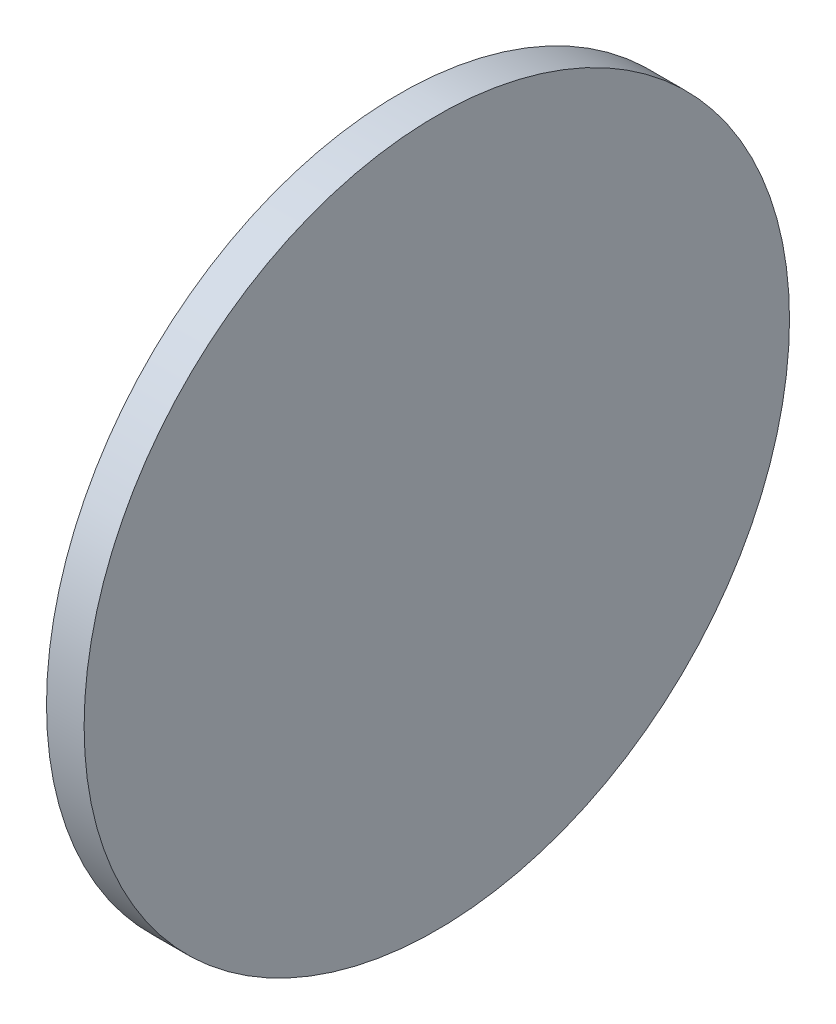
ISO-10303-21;
HEADER;
FILE_DESCRIPTION(('STEP AP214'),'2;1');
FILE_NAME('part.step','',(''),(''),'','','');
FILE_SCHEMA(('AUTOMOTIVE_DESIGN { 1 0 10303 214 1 1 1 1 }'));
ENDSEC;
DATA;
#1=APPLICATION_CONTEXT('core data for automotive mechanical design processes');
#2=APPLICATION_PROTOCOL_DEFINITION('international standard','automotive_design',2000,#1);
#3=PRODUCT_CONTEXT('',#1,'mechanical');
#4=PRODUCT('Part','Part','',(#3));
#5=PRODUCT_RELATED_PRODUCT_CATEGORY('part','',(#4));
#6=PRODUCT_DEFINITION_FORMATION('','',#4);
#7=PRODUCT_DEFINITION_CONTEXT('part definition',#1,'design');
#8=PRODUCT_DEFINITION('design','',#6,#7);
#9=PRODUCT_DEFINITION_SHAPE('','',#8);
#10=(LENGTH_UNIT() NAMED_UNIT(*) SI_UNIT(.MILLI.,.METRE.));
#11=(NAMED_UNIT(*) PLANE_ANGLE_UNIT() SI_UNIT($,.RADIAN.));
#12=(NAMED_UNIT(*) SI_UNIT($,.STERADIAN.) SOLID_ANGLE_UNIT());
#13=UNCERTAINTY_MEASURE_WITH_UNIT(LENGTH_MEASURE(1.E-05),#10,'distance_accuracy_value','');
#14=(GEOMETRIC_REPRESENTATION_CONTEXT(3) GLOBAL_UNCERTAINTY_ASSIGNED_CONTEXT((#13)) GLOBAL_UNIT_ASSIGNED_CONTEXT((#10,
#11,#12)) REPRESENTATION_CONTEXT('',''));
#15=CARTESIAN_POINT('',(0.,0.,0.));
#16=DIRECTION('',(0.,0.,1.));
#17=DIRECTION('',(1.,0.,0.));
#18=AXIS2_PLACEMENT_3D('',#15,#16,#17);
#19=CARTESIAN_POINT('',(0.,205.,-60.));
#20=DIRECTION('',(-1.,0.,0.));
#21=DIRECTION('',(0.,0.,1.));
#22=AXIS2_PLACEMENT_3D('',#19,#20,#21);
#23=PLANE('',#22);
#24=CARTESIAN_POINT('',(0.,205.,-60.));
#25=DIRECTION('',(1.,0.,0.));
#26=DIRECTION('',(0.,0.,1.));
#27=AXIS2_PLACEMENT_3D('',#24,#25,#26);
#28=CIRCLE('',#27,75.);
#29=CARTESIAN_POINT('',(0.,205.,15.));
#30=VERTEX_POINT('',#29);
#31=EDGE_CURVE('E10',#30,#30,#28,.T.);
#32=ORIENTED_EDGE('',*,*,#31,.F.);
#33=EDGE_LOOP('',(#32));
#34=FACE_BOUND('',#33,.T.);
#35=CARTESIAN_POINT('',(0.,140.,-25.9999999999999));
#36=DIRECTION('',(-1.,0.,0.));
#37=DIRECTION('',(0.,0.,1.));
#38=AXIS2_PLACEMENT_3D('',#35,#36,#37);
#39=CIRCLE('',#38,1.5);
#40=CARTESIAN_POINT('',(0.,140.,-24.4999999999999));
#41=VERTEX_POINT('',#40);
#42=EDGE_CURVE('E105',#41,#41,#39,.T.);
#43=ORIENTED_EDGE('',*,*,#42,.F.);
#44=EDGE_LOOP('',(#43));
#45=FACE_BOUND('',#44,.T.);
#46=CARTESIAN_POINT('',(0.,140.,-93.9999999999999));
#47=DIRECTION('',(-1.,0.,0.));
#48=DIRECTION('',(0.,0.,1.));
#49=AXIS2_PLACEMENT_3D('',#46,#47,#48);
#50=CIRCLE('',#49,1.5);
#51=CARTESIAN_POINT('',(0.,140.,-92.4999999999999));
#52=VERTEX_POINT('',#51);
#53=EDGE_CURVE('E99',#52,#52,#50,.T.);
#54=ORIENTED_EDGE('',*,*,#53,.F.);
#55=EDGE_LOOP('',(#54));
#56=FACE_BOUND('',#55,.T.);
#57=CARTESIAN_POINT('',(0.,254.497474683058,-10.5025253169412));
#58=DIRECTION('',(1.,0.,0.));
#59=DIRECTION('',(0.,0.,-1.));
#60=AXIS2_PLACEMENT_3D('',#57,#58,#59);
#61=CIRCLE('',#60,1.75);
#62=CARTESIAN_POINT('',(0.,254.497474683058,-12.2525253169412));
#63=VERTEX_POINT('',#62);
#64=EDGE_CURVE('E90',#63,#63,#61,.T.);
#65=ORIENTED_EDGE('',*,*,#64,.T.);
#66=EDGE_LOOP('',(#65));
#67=FACE_BOUND('',#66,.T.);
#68=CARTESIAN_POINT('',(0.,205.,10.));
#69=DIRECTION('',(1.,0.,0.));
#70=DIRECTION('',(0.,0.,-1.));
#71=AXIS2_PLACEMENT_3D('',#68,#69,#70);
#72=CIRCLE('',#71,1.75);
#73=CARTESIAN_POINT('',(0.,205.,8.25000000000002));
#74=VERTEX_POINT('',#73);
#75=EDGE_CURVE('E84',#74,#74,#72,.T.);
#76=ORIENTED_EDGE('',*,*,#75,.T.);
#77=EDGE_LOOP('',(#76));
#78=FACE_BOUND('',#77,.T.);
#79=CARTESIAN_POINT('',(0.,140.,-81.));
#80=DIRECTION('',(1.,0.,0.));
#81=DIRECTION('',(0.,0.,-1.));
#82=AXIS2_PLACEMENT_3D('',#79,#80,#81);
#83=CIRCLE('',#82,1.75);
#84=CARTESIAN_POINT('',(0.,140.,-82.75));
#85=VERTEX_POINT('',#84);
#86=EDGE_CURVE('E78',#85,#85,#83,.T.);
#87=ORIENTED_EDGE('',*,*,#86,.T.);
#88=EDGE_LOOP('',(#87));
#89=FACE_BOUND('',#88,.T.);
#90=CARTESIAN_POINT('',(0.,170.,-88.));
#91=DIRECTION('',(1.,0.,0.));
#92=DIRECTION('',(0.,0.,-1.));
#93=AXIS2_PLACEMENT_3D('',#90,#91,#92);
#94=CIRCLE('',#93,1.75);
#95=CARTESIAN_POINT('',(0.,170.,-89.75));
#96=VERTEX_POINT('',#95);
#97=EDGE_CURVE('E72',#96,#96,#94,.T.);
#98=ORIENTED_EDGE('',*,*,#97,.T.);
#99=EDGE_LOOP('',(#98));
#100=FACE_BOUND('',#99,.T.);
#101=CARTESIAN_POINT('',(0.,170.,-102.));
#102=DIRECTION('',(1.,0.,0.));
#103=DIRECTION('',(0.,0.,-1.));
#104=AXIS2_PLACEMENT_3D('',#101,#102,#103);
#105=CIRCLE('',#104,1.75);
#106=CARTESIAN_POINT('',(0.,170.,-103.75));
#107=VERTEX_POINT('',#106);
#108=EDGE_CURVE('E66',#107,#107,#105,.T.);
#109=ORIENTED_EDGE('',*,*,#108,.T.);
#110=EDGE_LOOP('',(#109));
#111=FACE_BOUND('',#110,.T.);
#112=CARTESIAN_POINT('',(0.,170.,-18.));
#113=DIRECTION('',(1.,0.,0.));
#114=DIRECTION('',(0.,0.,-1.));
#115=AXIS2_PLACEMENT_3D('',#112,#113,#114);
#116=CIRCLE('',#115,1.75);
#117=CARTESIAN_POINT('',(0.,170.,-19.75));
#118=VERTEX_POINT('',#117);
#119=EDGE_CURVE('E60',#118,#118,#116,.T.);
#120=ORIENTED_EDGE('',*,*,#119,.T.);
#121=EDGE_LOOP('',(#120));
#122=FACE_BOUND('',#121,.T.);
#123=CARTESIAN_POINT('',(0.,170.,-32.));
#124=DIRECTION('',(1.,0.,0.));
#125=DIRECTION('',(0.,0.,-1.));
#126=AXIS2_PLACEMENT_3D('',#123,#124,#125);
#127=CIRCLE('',#126,1.75);
#128=CARTESIAN_POINT('',(0.,170.,-33.75));
#129=VERTEX_POINT('',#128);
#130=EDGE_CURVE('E52',#129,#129,#127,.T.);
#131=ORIENTED_EDGE('',*,*,#130,.T.);
#132=EDGE_LOOP('',(#131));
#133=FACE_BOUND('',#132,.T.);
#134=CARTESIAN_POINT('',(0.,205.,-60.));
#135=DIRECTION('',(1.,0.,0.));
#136=DIRECTION('',(0.,0.,-1.));
#137=AXIS2_PLACEMENT_3D('',#134,#135,#136);
#138=CIRCLE('',#137,12.5);
#139=CARTESIAN_POINT('',(0.,205.,-72.5));
#140=VERTEX_POINT('',#139);
#141=EDGE_CURVE('E44',#140,#140,#138,.T.);
#142=ORIENTED_EDGE('',*,*,#141,.T.);
#143=EDGE_LOOP('',(#142));
#144=FACE_BOUND('',#143,.T.);
#145=CARTESIAN_POINT('',(0.,177.,-25.));
#146=DIRECTION('',(1.,0.,0.));
#147=DIRECTION('',(0.,0.,-1.));
#148=AXIS2_PLACEMENT_3D('',#145,#146,#147);
#149=CIRCLE('',#148,1.75);
#150=CARTESIAN_POINT('',(0.,177.,-26.75));
#151=VERTEX_POINT('',#150);
#152=EDGE_CURVE('E48',#151,#151,#149,.T.);
#153=ORIENTED_EDGE('',*,*,#152,.T.);
#154=EDGE_LOOP('',(#153));
#155=FACE_BOUND('',#154,.T.);
#156=CARTESIAN_POINT('',(0.,163.,-25.));
#157=DIRECTION('',(1.,0.,0.));
#158=DIRECTION('',(0.,0.,-1.));
#159=AXIS2_PLACEMENT_3D('',#156,#157,#158);
#160=CIRCLE('',#159,1.75);
#161=CARTESIAN_POINT('',(0.,163.,-26.75));
#162=VERTEX_POINT('',#161);
#163=EDGE_CURVE('E57',#162,#162,#160,.T.);
#164=ORIENTED_EDGE('',*,*,#163,.T.);
#165=EDGE_LOOP('',(#164));
#166=FACE_BOUND('',#165,.T.);
#167=CARTESIAN_POINT('',(0.,177.,-95.));
#168=DIRECTION('',(1.,0.,0.));
#169=DIRECTION('',(0.,0.,-1.));
#170=AXIS2_PLACEMENT_3D('',#167,#168,#169);
#171=CIRCLE('',#170,1.75);
#172=CARTESIAN_POINT('',(0.,177.,-96.75));
#173=VERTEX_POINT('',#172);
#174=EDGE_CURVE('E63',#173,#173,#171,.T.);
#175=ORIENTED_EDGE('',*,*,#174,.T.);
#176=EDGE_LOOP('',(#175));
#177=FACE_BOUND('',#176,.T.);
#178=CARTESIAN_POINT('',(0.,163.,-95.));
#179=DIRECTION('',(1.,0.,0.));
#180=DIRECTION('',(0.,0.,-1.));
#181=AXIS2_PLACEMENT_3D('',#178,#179,#180);
#182=CIRCLE('',#181,1.75);
#183=CARTESIAN_POINT('',(0.,163.,-96.75));
#184=VERTEX_POINT('',#183);
#185=EDGE_CURVE('E69',#184,#184,#182,.T.);
#186=ORIENTED_EDGE('',*,*,#185,.T.);
#187=EDGE_LOOP('',(#186));
#188=FACE_BOUND('',#187,.T.);
#189=CARTESIAN_POINT('',(0.,140.,-39.));
#190=DIRECTION('',(1.,0.,0.));
#191=DIRECTION('',(0.,0.,-1.));
#192=AXIS2_PLACEMENT_3D('',#189,#190,#191);
#193=CIRCLE('',#192,1.75);
#194=CARTESIAN_POINT('',(0.,140.,-40.75));
#195=VERTEX_POINT('',#194);
#196=EDGE_CURVE('E75',#195,#195,#193,.T.);
#197=ORIENTED_EDGE('',*,*,#196,.T.);
#198=EDGE_LOOP('',(#197));
#199=FACE_BOUND('',#198,.T.);
#200=CARTESIAN_POINT('',(0.,275.,-60.));
#201=DIRECTION('',(1.,0.,0.));
#202=DIRECTION('',(0.,0.,-1.));
#203=AXIS2_PLACEMENT_3D('',#200,#201,#202);
#204=CIRCLE('',#203,1.75);
#205=CARTESIAN_POINT('',(0.,275.,-61.75));
#206=VERTEX_POINT('',#205);
#207=EDGE_CURVE('E81',#206,#206,#204,.T.);
#208=ORIENTED_EDGE('',*,*,#207,.T.);
#209=EDGE_LOOP('',(#208));
#210=FACE_BOUND('',#209,.T.);
#211=CARTESIAN_POINT('',(0.,205.,-130.));
#212=DIRECTION('',(1.,0.,0.));
#213=DIRECTION('',(0.,0.,-1.));
#214=AXIS2_PLACEMENT_3D('',#211,#212,#213);
#215=CIRCLE('',#214,1.75000000000001);
#216=CARTESIAN_POINT('',(0.,205.,-131.75));
#217=VERTEX_POINT('',#216);
#218=EDGE_CURVE('E87',#217,#217,#215,.T.);
#219=ORIENTED_EDGE('',*,*,#218,.T.);
#220=EDGE_LOOP('',(#219));
#221=FACE_BOUND('',#220,.T.);
#222=CARTESIAN_POINT('',(0.,254.497474683059,-109.497474683058));
#223=DIRECTION('',(1.,0.,0.));
#224=DIRECTION('',(0.,0.,-1.));
#225=AXIS2_PLACEMENT_3D('',#222,#223,#224);
#226=CIRCLE('',#225,1.75);
#227=CARTESIAN_POINT('',(0.,254.497474683059,-111.247474683058));
#228=VERTEX_POINT('',#227);
#229=EDGE_CURVE('E93',#228,#228,#226,.T.);
#230=ORIENTED_EDGE('',*,*,#229,.T.);
#231=EDGE_LOOP('',(#230));
#232=FACE_BOUND('',#231,.T.);
#233=ADVANCED_FACE('F37',(#34,#45,#56,#67,#78,#89,#100,#111,#122,#133,#144,#155,#166,#177,#188,
#199,#210,#221,#232),#23,.T.);
#234=CARTESIAN_POINT('',(5.,205.,-60.));
#235=DIRECTION('',(-1.,0.,0.));
#236=DIRECTION('',(0.,0.,1.));
#237=AXIS2_PLACEMENT_3D('',#234,#235,#236);
#238=CYLINDRICAL_SURFACE('',#237,75.);
#239=ORIENTED_EDGE('',*,*,#31,.T.);
#240=EDGE_LOOP('',(#239));
#241=FACE_BOUND('',#240,.T.);
#242=CARTESIAN_POINT('',(8.,205.,-60.));
#243=DIRECTION('',(1.,0.,0.));
#244=DIRECTION('',(0.,0.,-1.));
#245=AXIS2_PLACEMENT_3D('',#242,#243,#244);
#246=CIRCLE('',#245,75.);
#247=CARTESIAN_POINT('',(8.,205.,-135.));
#248=VERTEX_POINT('',#247);
#249=EDGE_CURVE('E156',#248,#248,#246,.T.);
#250=ORIENTED_EDGE('',*,*,#249,.F.);
#251=EDGE_LOOP('',(#250));
#252=FACE_BOUND('',#251,.T.);
#253=ADVANCED_FACE('F39',(#241,#252),#238,.T.);
#254=CARTESIAN_POINT('',(5.,205.,-60.));
#255=DIRECTION('',(-1.,0.,0.));
#256=DIRECTION('',(0.,0.,1.));
#257=AXIS2_PLACEMENT_3D('',#254,#255,#256);
#258=CYLINDRICAL_SURFACE('',#257,12.5);
#259=CARTESIAN_POINT('',(5.,205.,-60.));
#260=DIRECTION('',(1.,0.,0.));
#261=DIRECTION('',(0.,0.,-1.));
#262=AXIS2_PLACEMENT_3D('',#259,#260,#261);
#263=CIRCLE('',#262,12.5);
#264=CARTESIAN_POINT('',(5.,205.,-72.5));
#265=VERTEX_POINT('',#264);
#266=EDGE_CURVE('E108',#265,#265,#263,.T.);
#267=ORIENTED_EDGE('',*,*,#266,.T.);
#268=EDGE_LOOP('',(#267));
#269=FACE_BOUND('',#268,.T.);
#270=ORIENTED_EDGE('',*,*,#141,.F.);
#271=EDGE_LOOP('',(#270));
#272=FACE_BOUND('',#271,.T.);
#273=ADVANCED_FACE('F163',(#269,#272),#258,.F.);
#274=CARTESIAN_POINT('',(5.,177.,-25.));
#275=DIRECTION('',(-1.,0.,0.));
#276=DIRECTION('',(0.,0.,1.));
#277=AXIS2_PLACEMENT_3D('',#274,#275,#276);
#278=CYLINDRICAL_SURFACE('',#277,1.75);
#279=CARTESIAN_POINT('',(5.,177.,-25.));
#280=DIRECTION('',(1.,0.,0.));
#281=DIRECTION('',(0.,0.,-1.));
#282=AXIS2_PLACEMENT_3D('',#279,#280,#281);
#283=CIRCLE('',#282,1.75);
#284=CARTESIAN_POINT('',(5.,177.,-26.75));
#285=VERTEX_POINT('',#284);
#286=EDGE_CURVE('E111',#285,#285,#283,.T.);
#287=ORIENTED_EDGE('',*,*,#286,.T.);
#288=EDGE_LOOP('',(#287));
#289=FACE_BOUND('',#288,.T.);
#290=ORIENTED_EDGE('',*,*,#152,.F.);
#291=EDGE_LOOP('',(#290));
#292=FACE_BOUND('',#291,.T.);
#293=ADVANCED_FACE('F169',(#289,#292),#278,.F.);
#294=CARTESIAN_POINT('',(5.,170.,-32.));
#295=DIRECTION('',(-1.,0.,0.));
#296=DIRECTION('',(0.,0.,1.));
#297=AXIS2_PLACEMENT_3D('',#294,#295,#296);
#298=CYLINDRICAL_SURFACE('',#297,1.75);
#299=CARTESIAN_POINT('',(5.,170.,-32.));
#300=DIRECTION('',(1.,0.,0.));
#301=DIRECTION('',(0.,0.,-1.));
#302=AXIS2_PLACEMENT_3D('',#299,#300,#301);
#303=CIRCLE('',#302,1.75);
#304=CARTESIAN_POINT('',(5.,170.,-33.75));
#305=VERTEX_POINT('',#304);
#306=EDGE_CURVE('E114',#305,#305,#303,.T.);
#307=ORIENTED_EDGE('',*,*,#306,.T.);
#308=EDGE_LOOP('',(#307));
#309=FACE_BOUND('',#308,.T.);
#310=ORIENTED_EDGE('',*,*,#130,.F.);
#311=EDGE_LOOP('',(#310));
#312=FACE_BOUND('',#311,.T.);
#313=ADVANCED_FACE('F181',(#309,#312),#298,.F.);
#314=CARTESIAN_POINT('',(5.,163.,-25.));
#315=DIRECTION('',(-1.,0.,0.));
#316=DIRECTION('',(0.,0.,1.));
#317=AXIS2_PLACEMENT_3D('',#314,#315,#316);
#318=CYLINDRICAL_SURFACE('',#317,1.75);
#319=CARTESIAN_POINT('',(5.,163.,-25.));
#320=DIRECTION('',(1.,0.,0.));
#321=DIRECTION('',(0.,0.,-1.));
#322=AXIS2_PLACEMENT_3D('',#319,#320,#321);
#323=CIRCLE('',#322,1.75);
#324=CARTESIAN_POINT('',(5.,163.,-26.75));
#325=VERTEX_POINT('',#324);
#326=EDGE_CURVE('E117',#325,#325,#323,.T.);
#327=ORIENTED_EDGE('',*,*,#326,.T.);
#328=EDGE_LOOP('',(#327));
#329=FACE_BOUND('',#328,.T.);
#330=ORIENTED_EDGE('',*,*,#163,.F.);
#331=EDGE_LOOP('',(#330));
#332=FACE_BOUND('',#331,.T.);
#333=ADVANCED_FACE('F185',(#329,#332),#318,.F.);
#334=CARTESIAN_POINT('',(5.,170.,-18.));
#335=DIRECTION('',(-1.,0.,0.));
#336=DIRECTION('',(0.,0.,1.));
#337=AXIS2_PLACEMENT_3D('',#334,#335,#336);
#338=CYLINDRICAL_SURFACE('',#337,1.75);
#339=CARTESIAN_POINT('',(5.,170.,-18.));
#340=DIRECTION('',(1.,0.,0.));
#341=DIRECTION('',(0.,0.,-1.));
#342=AXIS2_PLACEMENT_3D('',#339,#340,#341);
#343=CIRCLE('',#342,1.75);
#344=CARTESIAN_POINT('',(5.,170.,-19.75));
#345=VERTEX_POINT('',#344);
#346=EDGE_CURVE('E120',#345,#345,#343,.T.);
#347=ORIENTED_EDGE('',*,*,#346,.T.);
#348=EDGE_LOOP('',(#347));
#349=FACE_BOUND('',#348,.T.);
#350=ORIENTED_EDGE('',*,*,#119,.F.);
#351=EDGE_LOOP('',(#350));
#352=FACE_BOUND('',#351,.T.);
#353=ADVANCED_FACE('F189',(#349,#352),#338,.F.);
#354=CARTESIAN_POINT('',(5.,177.,-95.));
#355=DIRECTION('',(-1.,0.,0.));
#356=DIRECTION('',(0.,0.,1.));
#357=AXIS2_PLACEMENT_3D('',#354,#355,#356);
#358=CYLINDRICAL_SURFACE('',#357,1.75);
#359=CARTESIAN_POINT('',(5.,177.,-95.));
#360=DIRECTION('',(1.,0.,0.));
#361=DIRECTION('',(0.,0.,-1.));
#362=AXIS2_PLACEMENT_3D('',#359,#360,#361);
#363=CIRCLE('',#362,1.75);
#364=CARTESIAN_POINT('',(5.,177.,-96.75));
#365=VERTEX_POINT('',#364);
#366=EDGE_CURVE('E123',#365,#365,#363,.T.);
#367=ORIENTED_EDGE('',*,*,#366,.T.);
#368=EDGE_LOOP('',(#367));
#369=FACE_BOUND('',#368,.T.);
#370=ORIENTED_EDGE('',*,*,#174,.F.);
#371=EDGE_LOOP('',(#370));
#372=FACE_BOUND('',#371,.T.);
#373=ADVANCED_FACE('F193',(#369,#372),#358,.F.);
#374=CARTESIAN_POINT('',(5.,170.,-102.));
#375=DIRECTION('',(-1.,0.,0.));
#376=DIRECTION('',(0.,0.,1.));
#377=AXIS2_PLACEMENT_3D('',#374,#375,#376);
#378=CYLINDRICAL_SURFACE('',#377,1.75);
#379=CARTESIAN_POINT('',(5.,170.,-102.));
#380=DIRECTION('',(1.,0.,0.));
#381=DIRECTION('',(0.,0.,-1.));
#382=AXIS2_PLACEMENT_3D('',#379,#380,#381);
#383=CIRCLE('',#382,1.75);
#384=CARTESIAN_POINT('',(5.,170.,-103.75));
#385=VERTEX_POINT('',#384);
#386=EDGE_CURVE('E126',#385,#385,#383,.T.);
#387=ORIENTED_EDGE('',*,*,#386,.T.);
#388=EDGE_LOOP('',(#387));
#389=FACE_BOUND('',#388,.T.);
#390=ORIENTED_EDGE('',*,*,#108,.F.);
#391=EDGE_LOOP('',(#390));
#392=FACE_BOUND('',#391,.T.);
#393=ADVANCED_FACE('F197',(#389,#392),#378,.F.);
#394=CARTESIAN_POINT('',(5.,163.,-95.));
#395=DIRECTION('',(-1.,0.,0.));
#396=DIRECTION('',(0.,0.,1.));
#397=AXIS2_PLACEMENT_3D('',#394,#395,#396);
#398=CYLINDRICAL_SURFACE('',#397,1.75);
#399=CARTESIAN_POINT('',(5.,163.,-95.));
#400=DIRECTION('',(1.,0.,0.));
#401=DIRECTION('',(0.,0.,-1.));
#402=AXIS2_PLACEMENT_3D('',#399,#400,#401);
#403=CIRCLE('',#402,1.75);
#404=CARTESIAN_POINT('',(5.,163.,-96.75));
#405=VERTEX_POINT('',#404);
#406=EDGE_CURVE('E129',#405,#405,#403,.T.);
#407=ORIENTED_EDGE('',*,*,#406,.T.);
#408=EDGE_LOOP('',(#407));
#409=FACE_BOUND('',#408,.T.);
#410=ORIENTED_EDGE('',*,*,#185,.F.);
#411=EDGE_LOOP('',(#410));
#412=FACE_BOUND('',#411,.T.);
#413=ADVANCED_FACE('F201',(#409,#412),#398,.F.);
#414=CARTESIAN_POINT('',(5.,170.,-88.));
#415=DIRECTION('',(-1.,0.,0.));
#416=DIRECTION('',(0.,0.,1.));
#417=AXIS2_PLACEMENT_3D('',#414,#415,#416);
#418=CYLINDRICAL_SURFACE('',#417,1.75);
#419=CARTESIAN_POINT('',(5.,170.,-88.));
#420=DIRECTION('',(1.,0.,0.));
#421=DIRECTION('',(0.,0.,-1.));
#422=AXIS2_PLACEMENT_3D('',#419,#420,#421);
#423=CIRCLE('',#422,1.75);
#424=CARTESIAN_POINT('',(5.,170.,-89.75));
#425=VERTEX_POINT('',#424);
#426=EDGE_CURVE('E132',#425,#425,#423,.T.);
#427=ORIENTED_EDGE('',*,*,#426,.T.);
#428=EDGE_LOOP('',(#427));
#429=FACE_BOUND('',#428,.T.);
#430=ORIENTED_EDGE('',*,*,#97,.F.);
#431=EDGE_LOOP('',(#430));
#432=FACE_BOUND('',#431,.T.);
#433=ADVANCED_FACE('F205',(#429,#432),#418,.F.);
#434=CARTESIAN_POINT('',(5.,140.,-39.));
#435=DIRECTION('',(-1.,0.,0.));
#436=DIRECTION('',(0.,0.,1.));
#437=AXIS2_PLACEMENT_3D('',#434,#435,#436);
#438=CYLINDRICAL_SURFACE('',#437,1.75);
#439=CARTESIAN_POINT('',(5.,140.,-39.));
#440=DIRECTION('',(1.,0.,0.));
#441=DIRECTION('',(0.,0.,-1.));
#442=AXIS2_PLACEMENT_3D('',#439,#440,#441);
#443=CIRCLE('',#442,1.75);
#444=CARTESIAN_POINT('',(5.,140.,-40.75));
#445=VERTEX_POINT('',#444);
#446=EDGE_CURVE('E135',#445,#445,#443,.T.);
#447=ORIENTED_EDGE('',*,*,#446,.T.);
#448=EDGE_LOOP('',(#447));
#449=FACE_BOUND('',#448,.T.);
#450=ORIENTED_EDGE('',*,*,#196,.F.);
#451=EDGE_LOOP('',(#450));
#452=FACE_BOUND('',#451,.T.);
#453=ADVANCED_FACE('F209',(#449,#452),#438,.F.);
#454=CARTESIAN_POINT('',(5.,140.,-81.));
#455=DIRECTION('',(-1.,0.,0.));
#456=DIRECTION('',(0.,0.,1.));
#457=AXIS2_PLACEMENT_3D('',#454,#455,#456);
#458=CYLINDRICAL_SURFACE('',#457,1.75);
#459=CARTESIAN_POINT('',(5.,140.,-81.));
#460=DIRECTION('',(1.,0.,0.));
#461=DIRECTION('',(0.,0.,-1.));
#462=AXIS2_PLACEMENT_3D('',#459,#460,#461);
#463=CIRCLE('',#462,1.75);
#464=CARTESIAN_POINT('',(5.,140.,-82.75));
#465=VERTEX_POINT('',#464);
#466=EDGE_CURVE('E138',#465,#465,#463,.T.);
#467=ORIENTED_EDGE('',*,*,#466,.T.);
#468=EDGE_LOOP('',(#467));
#469=FACE_BOUND('',#468,.T.);
#470=ORIENTED_EDGE('',*,*,#86,.F.);
#471=EDGE_LOOP('',(#470));
#472=FACE_BOUND('',#471,.T.);
#473=ADVANCED_FACE('F213',(#469,#472),#458,.F.);
#474=CARTESIAN_POINT('',(5.,275.,-60.));
#475=DIRECTION('',(-1.,0.,0.));
#476=DIRECTION('',(0.,0.,1.));
#477=AXIS2_PLACEMENT_3D('',#474,#475,#476);
#478=CYLINDRICAL_SURFACE('',#477,1.75);
#479=CARTESIAN_POINT('',(5.,275.,-60.));
#480=DIRECTION('',(1.,0.,0.));
#481=DIRECTION('',(0.,0.,-1.));
#482=AXIS2_PLACEMENT_3D('',#479,#480,#481);
#483=CIRCLE('',#482,1.75);
#484=CARTESIAN_POINT('',(5.,275.,-61.75));
#485=VERTEX_POINT('',#484);
#486=EDGE_CURVE('E141',#485,#485,#483,.T.);
#487=ORIENTED_EDGE('',*,*,#486,.T.);
#488=EDGE_LOOP('',(#487));
#489=FACE_BOUND('',#488,.T.);
#490=ORIENTED_EDGE('',*,*,#207,.F.);
#491=EDGE_LOOP('',(#490));
#492=FACE_BOUND('',#491,.T.);
#493=ADVANCED_FACE('F217',(#489,#492),#478,.F.);
#494=CARTESIAN_POINT('',(5.,205.,10.));
#495=DIRECTION('',(-1.,0.,0.));
#496=DIRECTION('',(0.,0.,1.));
#497=AXIS2_PLACEMENT_3D('',#494,#495,#496);
#498=CYLINDRICAL_SURFACE('',#497,1.75);
#499=CARTESIAN_POINT('',(5.,205.,10.));
#500=DIRECTION('',(1.,0.,0.));
#501=DIRECTION('',(0.,0.,-1.));
#502=AXIS2_PLACEMENT_3D('',#499,#500,#501);
#503=CIRCLE('',#502,1.75);
#504=CARTESIAN_POINT('',(5.,205.,8.25000000000002));
#505=VERTEX_POINT('',#504);
#506=EDGE_CURVE('E144',#505,#505,#503,.T.);
#507=ORIENTED_EDGE('',*,*,#506,.T.);
#508=EDGE_LOOP('',(#507));
#509=FACE_BOUND('',#508,.T.);
#510=ORIENTED_EDGE('',*,*,#75,.F.);
#511=EDGE_LOOP('',(#510));
#512=FACE_BOUND('',#511,.T.);
#513=ADVANCED_FACE('F221',(#509,#512),#498,.F.);
#514=CARTESIAN_POINT('',(5.,205.,-130.));
#515=DIRECTION('',(-1.,0.,0.));
#516=DIRECTION('',(0.,0.,1.));
#517=AXIS2_PLACEMENT_3D('',#514,#515,#516);
#518=CYLINDRICAL_SURFACE('',#517,1.75000000000001);
#519=CARTESIAN_POINT('',(5.,205.,-130.));
#520=DIRECTION('',(1.,0.,0.));
#521=DIRECTION('',(0.,0.,-1.));
#522=AXIS2_PLACEMENT_3D('',#519,#520,#521);
#523=CIRCLE('',#522,1.75000000000001);
#524=CARTESIAN_POINT('',(5.,205.,-131.75));
#525=VERTEX_POINT('',#524);
#526=EDGE_CURVE('E147',#525,#525,#523,.T.);
#527=ORIENTED_EDGE('',*,*,#526,.T.);
#528=EDGE_LOOP('',(#527));
#529=FACE_BOUND('',#528,.T.);
#530=ORIENTED_EDGE('',*,*,#218,.F.);
#531=EDGE_LOOP('',(#530));
#532=FACE_BOUND('',#531,.T.);
#533=ADVANCED_FACE('F225',(#529,#532),#518,.F.);
#534=CARTESIAN_POINT('',(5.,254.497474683058,-10.5025253169412));
#535=DIRECTION('',(-1.,0.,0.));
#536=DIRECTION('',(0.,0.,1.));
#537=AXIS2_PLACEMENT_3D('',#534,#535,#536);
#538=CYLINDRICAL_SURFACE('',#537,1.75);
#539=CARTESIAN_POINT('',(5.,254.497474683058,-10.5025253169412));
#540=DIRECTION('',(1.,0.,0.));
#541=DIRECTION('',(0.,0.,-1.));
#542=AXIS2_PLACEMENT_3D('',#539,#540,#541);
#543=CIRCLE('',#542,1.75);
#544=CARTESIAN_POINT('',(5.,254.497474683058,-12.2525253169412));
#545=VERTEX_POINT('',#544);
#546=EDGE_CURVE('E150',#545,#545,#543,.T.);
#547=ORIENTED_EDGE('',*,*,#546,.T.);
#548=EDGE_LOOP('',(#547));
#549=FACE_BOUND('',#548,.T.);
#550=ORIENTED_EDGE('',*,*,#64,.F.);
#551=EDGE_LOOP('',(#550));
#552=FACE_BOUND('',#551,.T.);
#553=ADVANCED_FACE('F229',(#549,#552),#538,.F.);
#554=CARTESIAN_POINT('',(5.,254.497474683059,-109.497474683058));
#555=DIRECTION('',(-1.,0.,0.));
#556=DIRECTION('',(0.,0.,1.));
#557=AXIS2_PLACEMENT_3D('',#554,#555,#556);
#558=CYLINDRICAL_SURFACE('',#557,1.75);
#559=CARTESIAN_POINT('',(5.,254.497474683059,-109.497474683058));
#560=DIRECTION('',(1.,0.,0.));
#561=DIRECTION('',(0.,0.,-1.));
#562=AXIS2_PLACEMENT_3D('',#559,#560,#561);
#563=CIRCLE('',#562,1.75);
#564=CARTESIAN_POINT('',(5.,254.497474683059,-111.247474683058));
#565=VERTEX_POINT('',#564);
#566=EDGE_CURVE('E153',#565,#565,#563,.T.);
#567=ORIENTED_EDGE('',*,*,#566,.T.);
#568=EDGE_LOOP('',(#567));
#569=FACE_BOUND('',#568,.T.);
#570=ORIENTED_EDGE('',*,*,#229,.F.);
#571=EDGE_LOOP('',(#570));
#572=FACE_BOUND('',#571,.T.);
#573=ADVANCED_FACE('F233',(#569,#572),#558,.F.);
#574=CARTESIAN_POINT('',(10.,140.,-93.9999999999999));
#575=DIRECTION('',(-1.,0.,0.));
#576=DIRECTION('',(0.,0.,1.));
#577=AXIS2_PLACEMENT_3D('',#574,#575,#576);
#578=CYLINDRICAL_SURFACE('',#577,1.5);
#579=ORIENTED_EDGE('',*,*,#53,.T.);
#580=EDGE_LOOP('',(#579));
#581=FACE_BOUND('',#580,.T.);
#582=CARTESIAN_POINT('',(5.,140.,-93.9999999999999));
#583=DIRECTION('',(-1.,0.,0.));
#584=DIRECTION('',(0.,0.,1.));
#585=AXIS2_PLACEMENT_3D('',#582,#583,#584);
#586=CIRCLE('',#585,1.5);
#587=CARTESIAN_POINT('',(5.,140.,-92.4999999999999));
#588=VERTEX_POINT('',#587);
#589=EDGE_CURVE('E96',#588,#588,#586,.T.);
#590=ORIENTED_EDGE('',*,*,#589,.F.);
#591=EDGE_LOOP('',(#590));
#592=FACE_BOUND('',#591,.T.);
#593=ADVANCED_FACE('F237',(#581,#592),#578,.F.);
#594=CARTESIAN_POINT('',(10.,140.,-25.9999999999999));
#595=DIRECTION('',(-1.,0.,0.));
#596=DIRECTION('',(0.,0.,1.));
#597=AXIS2_PLACEMENT_3D('',#594,#595,#596);
#598=CYLINDRICAL_SURFACE('',#597,1.5);
#599=ORIENTED_EDGE('',*,*,#42,.T.);
#600=EDGE_LOOP('',(#599));
#601=FACE_BOUND('',#600,.T.);
#602=CARTESIAN_POINT('',(5.,140.,-25.9999999999999));
#603=DIRECTION('',(-1.,0.,0.));
#604=DIRECTION('',(0.,0.,1.));
#605=AXIS2_PLACEMENT_3D('',#602,#603,#604);
#606=CIRCLE('',#605,1.5);
#607=CARTESIAN_POINT('',(5.,140.,-24.4999999999999));
#608=VERTEX_POINT('',#607);
#609=EDGE_CURVE('E102',#608,#608,#606,.T.);
#610=ORIENTED_EDGE('',*,*,#609,.F.);
#611=EDGE_LOOP('',(#610));
#612=FACE_BOUND('',#611,.T.);
#613=ADVANCED_FACE('F241',(#601,#612),#598,.F.);
#614=CARTESIAN_POINT('',(5.,205.,-60.));
#615=DIRECTION('',(1.,0.,0.));
#616=DIRECTION('',(0.,0.,-1.));
#617=AXIS2_PLACEMENT_3D('',#614,#615,#616);
#618=PLANE('',#617);
#619=ORIENTED_EDGE('',*,*,#609,.T.);
#620=EDGE_LOOP('',(#619));
#621=FACE_BOUND('',#620,.T.);
#622=ADVANCED_FACE('F244',(#621),#618,.F.);
#623=ORIENTED_EDGE('',*,*,#589,.T.);
#624=EDGE_LOOP('',(#623));
#625=FACE_BOUND('',#624,.T.);
#626=ADVANCED_FACE('F250',(#625),#618,.F.);
#627=ORIENTED_EDGE('',*,*,#566,.F.);
#628=EDGE_LOOP('',(#627));
#629=FACE_BOUND('',#628,.T.);
#630=ADVANCED_FACE('F246',(#629),#618,.F.);
#631=ORIENTED_EDGE('',*,*,#546,.F.);
#632=EDGE_LOOP('',(#631));
#633=FACE_BOUND('',#632,.T.);
#634=ADVANCED_FACE('F249',(#633),#618,.F.);
#635=ORIENTED_EDGE('',*,*,#526,.F.);
#636=EDGE_LOOP('',(#635));
#637=FACE_BOUND('',#636,.T.);
#638=ADVANCED_FACE('F368',(#637),#618,.F.);
#639=ORIENTED_EDGE('',*,*,#506,.F.);
#640=EDGE_LOOP('',(#639));
#641=FACE_BOUND('',#640,.T.);
#642=ADVANCED_FACE('F359',(#641),#618,.F.);
#643=ORIENTED_EDGE('',*,*,#486,.F.);
#644=EDGE_LOOP('',(#643));
#645=FACE_BOUND('',#644,.T.);
#646=ADVANCED_FACE('F353',(#645),#618,.F.);
#647=ORIENTED_EDGE('',*,*,#466,.F.);
#648=EDGE_LOOP('',(#647));
#649=FACE_BOUND('',#648,.T.);
#650=ADVANCED_FACE('F344',(#649),#618,.F.);
#651=ORIENTED_EDGE('',*,*,#446,.F.);
#652=EDGE_LOOP('',(#651));
#653=FACE_BOUND('',#652,.T.);
#654=ADVANCED_FACE('F338',(#653),#618,.F.);
#655=ORIENTED_EDGE('',*,*,#426,.F.);
#656=EDGE_LOOP('',(#655));
#657=FACE_BOUND('',#656,.T.);
#658=ADVANCED_FACE('F329',(#657),#618,.F.);
#659=ORIENTED_EDGE('',*,*,#406,.F.);
#660=EDGE_LOOP('',(#659));
#661=FACE_BOUND('',#660,.T.);
#662=ADVANCED_FACE('F323',(#661),#618,.F.);
#663=ORIENTED_EDGE('',*,*,#386,.F.);
#664=EDGE_LOOP('',(#663));
#665=FACE_BOUND('',#664,.T.);
#666=ADVANCED_FACE('F314',(#665),#618,.F.);
#667=ORIENTED_EDGE('',*,*,#366,.F.);
#668=EDGE_LOOP('',(#667));
#669=FACE_BOUND('',#668,.T.);
#670=ADVANCED_FACE('F308',(#669),#618,.F.);
#671=ORIENTED_EDGE('',*,*,#346,.F.);
#672=EDGE_LOOP('',(#671));
#673=FACE_BOUND('',#672,.T.);
#674=ADVANCED_FACE('F299',(#673),#618,.F.);
#675=ORIENTED_EDGE('',*,*,#326,.F.);
#676=EDGE_LOOP('',(#675));
#677=FACE_BOUND('',#676,.T.);
#678=ADVANCED_FACE('F269',(#677),#618,.F.);
#679=ORIENTED_EDGE('',*,*,#306,.F.);
#680=EDGE_LOOP('',(#679));
#681=FACE_BOUND('',#680,.T.);
#682=ADVANCED_FACE('F262',(#681),#618,.F.);
#683=ORIENTED_EDGE('',*,*,#286,.F.);
#684=EDGE_LOOP('',(#683));
#685=FACE_BOUND('',#684,.T.);
#686=ADVANCED_FACE('F257',(#685),#618,.F.);
#687=ORIENTED_EDGE('',*,*,#266,.F.);
#688=EDGE_LOOP('',(#687));
#689=FACE_BOUND('',#688,.T.);
#690=ADVANCED_FACE('F252',(#689),#618,.F.);
#691=CARTESIAN_POINT('',(8.,205.,-60.));
#692=DIRECTION('',(1.,0.,0.));
#693=DIRECTION('',(0.,0.,-1.));
#694=AXIS2_PLACEMENT_3D('',#691,#692,#693);
#695=PLANE('',#694);
#696=ORIENTED_EDGE('',*,*,#249,.T.);
#697=EDGE_LOOP('',(#696));
#698=FACE_BOUND('',#697,.T.);
#699=ADVANCED_FACE('F160',(#698),#695,.T.);
#700=CLOSED_SHELL('',(#233,#253,#273,#293,#313,#333,#353,#373,#393,#413,#433,#453,#473,#493,
#513,#533,#553,#573,#593,#613,#622,#626,#630,#634,#638,#642,#646,#650,#654,#658,#662,#666,#670,
#674,#678,#682,#686,#690,#699));
#701=MANIFOLD_SOLID_BREP('B2',#700);
#702=ADVANCED_BREP_SHAPE_REPRESENTATION('',(#18,#701),#14);
#703=SHAPE_DEFINITION_REPRESENTATION(#9,#702);
ENDSEC;
END-ISO-10303-21;
